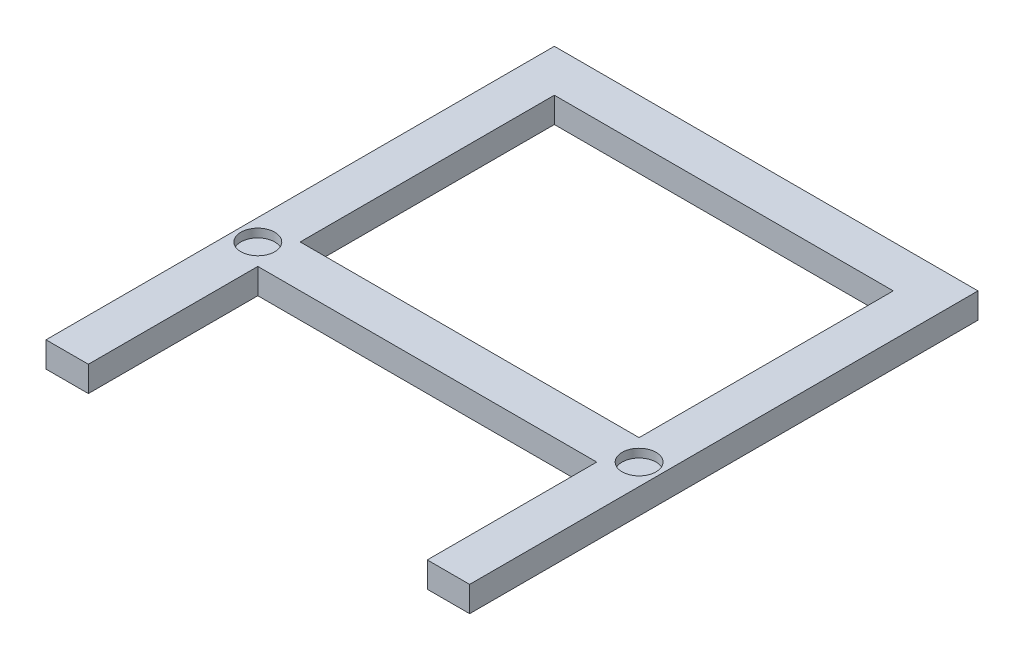
ISO-10303-21;
HEADER;
FILE_DESCRIPTION(('STEP AP214'),'2;1');
FILE_NAME('part.step','',(''),(''),'','','');
FILE_SCHEMA(('AUTOMOTIVE_DESIGN { 1 0 10303 214 1 1 1 1 }'));
ENDSEC;
DATA;
#1=APPLICATION_CONTEXT('core data for automotive mechanical design processes');
#2=APPLICATION_PROTOCOL_DEFINITION('international standard','automotive_design',2000,#1);
#3=PRODUCT_CONTEXT('',#1,'mechanical');
#4=PRODUCT('Part','Part','',(#3));
#5=PRODUCT_RELATED_PRODUCT_CATEGORY('part','',(#4));
#6=PRODUCT_DEFINITION_FORMATION('','',#4);
#7=PRODUCT_DEFINITION_CONTEXT('part definition',#1,'design');
#8=PRODUCT_DEFINITION('design','',#6,#7);
#9=PRODUCT_DEFINITION_SHAPE('','',#8);
#10=(LENGTH_UNIT() NAMED_UNIT(*) SI_UNIT(.MILLI.,.METRE.));
#11=(NAMED_UNIT(*) PLANE_ANGLE_UNIT() SI_UNIT($,.RADIAN.));
#12=(NAMED_UNIT(*) SI_UNIT($,.STERADIAN.) SOLID_ANGLE_UNIT());
#13=UNCERTAINTY_MEASURE_WITH_UNIT(LENGTH_MEASURE(1.E-05),#10,'distance_accuracy_value','');
#14=(GEOMETRIC_REPRESENTATION_CONTEXT(3) GLOBAL_UNCERTAINTY_ASSIGNED_CONTEXT((#13)) GLOBAL_UNIT_ASSIGNED_CONTEXT((#10,
#11,#12)) REPRESENTATION_CONTEXT('',''));
#15=CARTESIAN_POINT('',(0.,0.,0.));
#16=DIRECTION('',(0.,0.,1.));
#17=DIRECTION('',(1.,0.,0.));
#18=AXIS2_PLACEMENT_3D('',#15,#16,#17);
#19=CARTESIAN_POINT('',(0.,3.,0.));
#20=DIRECTION('',(0.,-1.,0.));
#21=DIRECTION('',(0.,0.,-1.));
#22=AXIS2_PLACEMENT_3D('',#19,#20,#21);
#23=PLANE('',#22);
#24=CARTESIAN_POINT('',(-45.,3.,75.));
#25=DIRECTION('',(0.,1.,0.));
#26=DIRECTION('',(0.,0.,1.));
#27=AXIS2_PLACEMENT_3D('',#24,#25,#26);
#28=CIRCLE('',#27,4.00000000000001);
#29=CARTESIAN_POINT('',(-45.,3.,79.));
#30=VERTEX_POINT('',#29);
#31=EDGE_CURVE('E355',#30,#30,#28,.T.);
#32=ORIENTED_EDGE('',*,*,#31,.F.);
#33=EDGE_LOOP('',(#32));
#34=FACE_BOUND('',#33,.T.);
#35=CARTESIAN_POINT('',(45.,3.,75.));
#36=DIRECTION('',(0.,1.,0.));
#37=DIRECTION('',(0.,0.,1.));
#38=AXIS2_PLACEMENT_3D('',#35,#36,#37);
#39=CIRCLE('',#38,4.00000000000001);
#40=CARTESIAN_POINT('',(45.,3.,79.));
#41=VERTEX_POINT('',#40);
#42=EDGE_CURVE('E359',#41,#41,#39,.T.);
#43=ORIENTED_EDGE('',*,*,#42,.F.);
#44=EDGE_LOOP('',(#43));
#45=FACE_BOUND('',#44,.T.);
#46=DIRECTION('',(1.,0.,0.));
#47=VECTOR('',#46,1.);
#48=CARTESIAN_POINT('',(50.,3.,120.));
#49=LINE('',#48,#47);
#50=CARTESIAN_POINT('',(40.,3.,120.));
#51=VERTEX_POINT('',#50);
#52=CARTESIAN_POINT('',(50.,3.,120.));
#53=VERTEX_POINT('',#52);
#54=EDGE_CURVE('E183',#51,#53,#49,.T.);
#55=ORIENTED_EDGE('',*,*,#54,.T.);
#56=DIRECTION('',(0.,0.,-1.));
#57=VECTOR('',#56,1.);
#58=CARTESIAN_POINT('',(50.,3.,0.));
#59=LINE('',#58,#57);
#60=CARTESIAN_POINT('',(50.,3.,0.));
#61=VERTEX_POINT('',#60);
#62=EDGE_CURVE('E187',#53,#61,#59,.T.);
#63=ORIENTED_EDGE('',*,*,#62,.T.);
#64=DIRECTION('',(-1.,0.,0.));
#65=VECTOR('',#64,1.);
#66=CARTESIAN_POINT('',(-50.,3.,0.));
#67=LINE('',#66,#65);
#68=CARTESIAN_POINT('',(-50.,3.,0.));
#69=VERTEX_POINT('',#68);
#70=EDGE_CURVE('E191',#61,#69,#67,.T.);
#71=ORIENTED_EDGE('',*,*,#70,.T.);
#72=DIRECTION('',(0.,0.,1.));
#73=VECTOR('',#72,1.);
#74=CARTESIAN_POINT('',(-50.,3.,120.));
#75=LINE('',#74,#73);
#76=CARTESIAN_POINT('',(-50.,3.,120.));
#77=VERTEX_POINT('',#76);
#78=EDGE_CURVE('E194',#69,#77,#75,.T.);
#79=ORIENTED_EDGE('',*,*,#78,.T.);
#80=DIRECTION('',(1.,0.,0.));
#81=VECTOR('',#80,1.);
#82=CARTESIAN_POINT('',(-50.,3.,120.));
#83=LINE('',#82,#81);
#84=CARTESIAN_POINT('',(-40.,3.,120.));
#85=VERTEX_POINT('',#84);
#86=EDGE_CURVE('E197',#77,#85,#83,.T.);
#87=ORIENTED_EDGE('',*,*,#86,.T.);
#88=DIRECTION('',(0.,0.,-1.));
#89=VECTOR('',#88,1.);
#90=CARTESIAN_POINT('',(-40.,3.,80.));
#91=LINE('',#90,#89);
#92=CARTESIAN_POINT('',(-40.,3.,80.));
#93=VERTEX_POINT('',#92);
#94=EDGE_CURVE('E200',#85,#93,#91,.T.);
#95=ORIENTED_EDGE('',*,*,#94,.T.);
#96=DIRECTION('',(1.,0.,0.));
#97=VECTOR('',#96,1.);
#98=CARTESIAN_POINT('',(40.,3.,80.));
#99=LINE('',#98,#97);
#100=CARTESIAN_POINT('',(40.,3.,80.));
#101=VERTEX_POINT('',#100);
#102=EDGE_CURVE('E203',#93,#101,#99,.T.);
#103=ORIENTED_EDGE('',*,*,#102,.T.);
#104=DIRECTION('',(0.,0.,1.));
#105=VECTOR('',#104,1.);
#106=CARTESIAN_POINT('',(40.,3.,120.));
#107=LINE('',#106,#105);
#108=EDGE_CURVE('E206',#101,#51,#107,.T.);
#109=ORIENTED_EDGE('',*,*,#108,.T.);
#110=EDGE_LOOP('',(#55,#63,#71,#79,#87,#95,#103,#109));
#111=FACE_BOUND('',#110,.T.);
#112=DIRECTION('',(0.,0.,-1.));
#113=VECTOR('',#112,1.);
#114=CARTESIAN_POINT('',(40.,3.,70.));
#115=LINE('',#114,#113);
#116=CARTESIAN_POINT('',(40.,3.,70.));
#117=VERTEX_POINT('',#116);
#118=CARTESIAN_POINT('',(40.,3.,10.));
#119=VERTEX_POINT('',#118);
#120=EDGE_CURVE('E133',#117,#119,#115,.T.);
#121=ORIENTED_EDGE('',*,*,#120,.F.);
#122=DIRECTION('',(1.,0.,0.));
#123=VECTOR('',#122,1.);
#124=CARTESIAN_POINT('',(-40.,3.,70.));
#125=LINE('',#124,#123);
#126=CARTESIAN_POINT('',(-40.,3.,70.));
#127=VERTEX_POINT('',#126);
#128=EDGE_CURVE('E159',#127,#117,#125,.T.);
#129=ORIENTED_EDGE('',*,*,#128,.F.);
#130=DIRECTION('',(0.,0.,1.));
#131=VECTOR('',#130,1.);
#132=CARTESIAN_POINT('',(-40.,3.,10.));
#133=LINE('',#132,#131);
#134=CARTESIAN_POINT('',(-40.,3.,10.));
#135=VERTEX_POINT('',#134);
#136=EDGE_CURVE('E155',#135,#127,#133,.T.);
#137=ORIENTED_EDGE('',*,*,#136,.F.);
#138=DIRECTION('',(-1.,0.,0.));
#139=VECTOR('',#138,1.);
#140=CARTESIAN_POINT('',(40.,3.,10.));
#141=LINE('',#140,#139);
#142=EDGE_CURVE('E142',#119,#135,#141,.T.);
#143=ORIENTED_EDGE('',*,*,#142,.F.);
#144=EDGE_LOOP('',(#121,#129,#137,#143));
#145=FACE_BOUND('',#144,.T.);
#146=ADVANCED_FACE('F43',(#34,#45,#111,#145),#23,.F.);
#147=CARTESIAN_POINT('',(0.,-3.,0.));
#148=DIRECTION('',(0.,-1.,0.));
#149=DIRECTION('',(0.,0.,-1.));
#150=AXIS2_PLACEMENT_3D('',#147,#148,#149);
#151=PLANE('',#150);
#152=DIRECTION('',(1.,0.,0.));
#153=VECTOR('',#152,1.);
#154=CARTESIAN_POINT('',(50.,-3.,120.));
#155=LINE('',#154,#153);
#156=CARTESIAN_POINT('',(40.,-3.,120.));
#157=VERTEX_POINT('',#156);
#158=CARTESIAN_POINT('',(50.,-3.,120.));
#159=VERTEX_POINT('',#158);
#160=EDGE_CURVE('E151',#157,#159,#155,.T.);
#161=ORIENTED_EDGE('',*,*,#160,.F.);
#162=DIRECTION('',(0.,0.,1.));
#163=VECTOR('',#162,1.);
#164=CARTESIAN_POINT('',(40.,-3.,120.));
#165=LINE('',#164,#163);
#166=CARTESIAN_POINT('',(40.,-3.,80.));
#167=VERTEX_POINT('',#166);
#168=EDGE_CURVE('E188',#167,#157,#165,.T.);
#169=ORIENTED_EDGE('',*,*,#168,.F.);
#170=DIRECTION('',(1.,0.,0.));
#171=VECTOR('',#170,1.);
#172=CARTESIAN_POINT('',(40.,-3.,80.));
#173=LINE('',#172,#171);
#174=CARTESIAN_POINT('',(-40.,-3.,80.));
#175=VERTEX_POINT('',#174);
#176=EDGE_CURVE('E228',#175,#167,#173,.T.);
#177=ORIENTED_EDGE('',*,*,#176,.F.);
#178=DIRECTION('',(0.,0.,-1.));
#179=VECTOR('',#178,1.);
#180=CARTESIAN_POINT('',(-40.,-3.,80.));
#181=LINE('',#180,#179);
#182=CARTESIAN_POINT('',(-40.,-3.,120.));
#183=VERTEX_POINT('',#182);
#184=EDGE_CURVE('E225',#183,#175,#181,.T.);
#185=ORIENTED_EDGE('',*,*,#184,.F.);
#186=DIRECTION('',(1.,0.,0.));
#187=VECTOR('',#186,1.);
#188=CARTESIAN_POINT('',(-50.,-3.,120.));
#189=LINE('',#188,#187);
#190=CARTESIAN_POINT('',(-50.,-3.,120.));
#191=VERTEX_POINT('',#190);
#192=EDGE_CURVE('E222',#191,#183,#189,.T.);
#193=ORIENTED_EDGE('',*,*,#192,.F.);
#194=DIRECTION('',(0.,0.,1.));
#195=VECTOR('',#194,1.);
#196=CARTESIAN_POINT('',(-50.,-3.,120.));
#197=LINE('',#196,#195);
#198=CARTESIAN_POINT('',(-50.,-3.,0.));
#199=VERTEX_POINT('',#198);
#200=EDGE_CURVE('E219',#199,#191,#197,.T.);
#201=ORIENTED_EDGE('',*,*,#200,.F.);
#202=DIRECTION('',(-1.,0.,0.));
#203=VECTOR('',#202,1.);
#204=CARTESIAN_POINT('',(-50.,-3.,0.));
#205=LINE('',#204,#203);
#206=CARTESIAN_POINT('',(50.,-3.,0.));
#207=VERTEX_POINT('',#206);
#208=EDGE_CURVE('E216',#207,#199,#205,.T.);
#209=ORIENTED_EDGE('',*,*,#208,.F.);
#210=DIRECTION('',(0.,0.,-1.));
#211=VECTOR('',#210,1.);
#212=CARTESIAN_POINT('',(50.,-3.,0.));
#213=LINE('',#212,#211);
#214=EDGE_CURVE('E213',#159,#207,#213,.T.);
#215=ORIENTED_EDGE('',*,*,#214,.F.);
#216=EDGE_LOOP('',(#161,#169,#177,#185,#193,#201,#209,#215));
#217=FACE_BOUND('',#216,.T.);
#218=DIRECTION('',(1.,0.,0.));
#219=VECTOR('',#218,1.);
#220=CARTESIAN_POINT('',(-40.,-3.,70.));
#221=LINE('',#220,#219);
#222=CARTESIAN_POINT('',(-40.,-3.,70.));
#223=VERTEX_POINT('',#222);
#224=CARTESIAN_POINT('',(40.,-3.,70.));
#225=VERTEX_POINT('',#224);
#226=EDGE_CURVE('E143',#223,#225,#221,.T.);
#227=ORIENTED_EDGE('',*,*,#226,.T.);
#228=DIRECTION('',(0.,0.,-1.));
#229=VECTOR('',#228,1.);
#230=CARTESIAN_POINT('',(40.,-3.,70.));
#231=LINE('',#230,#229);
#232=CARTESIAN_POINT('',(40.,-3.,10.));
#233=VERTEX_POINT('',#232);
#234=EDGE_CURVE('E67',#225,#233,#231,.T.);
#235=ORIENTED_EDGE('',*,*,#234,.T.);
#236=DIRECTION('',(-1.,0.,0.));
#237=VECTOR('',#236,1.);
#238=CARTESIAN_POINT('',(40.,-3.,10.));
#239=LINE('',#238,#237);
#240=CARTESIAN_POINT('',(-40.,-3.,10.));
#241=VERTEX_POINT('',#240);
#242=EDGE_CURVE('E149',#233,#241,#239,.T.);
#243=ORIENTED_EDGE('',*,*,#242,.T.);
#244=DIRECTION('',(0.,0.,1.));
#245=VECTOR('',#244,1.);
#246=CARTESIAN_POINT('',(-40.,-3.,10.));
#247=LINE('',#246,#245);
#248=EDGE_CURVE('E170',#241,#223,#247,.T.);
#249=ORIENTED_EDGE('',*,*,#248,.T.);
#250=EDGE_LOOP('',(#227,#235,#243,#249));
#251=FACE_BOUND('',#250,.T.);
#252=ADVANCED_FACE('F267',(#217,#251),#151,.T.);
#253=CARTESIAN_POINT('',(50.,3.,120.));
#254=DIRECTION('',(0.,0.,-1.));
#255=DIRECTION('',(-1.,0.,0.));
#256=AXIS2_PLACEMENT_3D('',#253,#254,#255);
#257=PLANE('',#256);
#258=ORIENTED_EDGE('',*,*,#160,.T.);
#259=DIRECTION('',(0.,-1.,0.));
#260=VECTOR('',#259,1.);
#261=CARTESIAN_POINT('',(50.,3.,120.));
#262=LINE('',#261,#260);
#263=EDGE_CURVE('E11',#53,#159,#262,.T.);
#264=ORIENTED_EDGE('',*,*,#263,.F.);
#265=ORIENTED_EDGE('',*,*,#54,.F.);
#266=DIRECTION('',(0.,-1.,0.));
#267=VECTOR('',#266,1.);
#268=CARTESIAN_POINT('',(40.,3.,120.));
#269=LINE('',#268,#267);
#270=EDGE_CURVE('E209',#51,#157,#269,.T.);
#271=ORIENTED_EDGE('',*,*,#270,.T.);
#272=EDGE_LOOP('',(#258,#264,#265,#271));
#273=FACE_BOUND('',#272,.T.);
#274=ADVANCED_FACE('F45',(#273),#257,.F.);
#275=CARTESIAN_POINT('',(50.,3.,0.));
#276=DIRECTION('',(-1.,0.,0.));
#277=DIRECTION('',(0.,0.,1.));
#278=AXIS2_PLACEMENT_3D('',#275,#276,#277);
#279=PLANE('',#278);
#280=ORIENTED_EDGE('',*,*,#214,.T.);
#281=DIRECTION('',(0.,-1.,0.));
#282=VECTOR('',#281,1.);
#283=CARTESIAN_POINT('',(50.,3.,0.));
#284=LINE('',#283,#282);
#285=EDGE_CURVE('E52',#61,#207,#284,.T.);
#286=ORIENTED_EDGE('',*,*,#285,.F.);
#287=ORIENTED_EDGE('',*,*,#62,.F.);
#288=ORIENTED_EDGE('',*,*,#263,.T.);
#289=EDGE_LOOP('',(#280,#286,#287,#288));
#290=FACE_BOUND('',#289,.T.);
#291=ADVANCED_FACE('F284',(#290),#279,.F.);
#292=CARTESIAN_POINT('',(-50.,3.,0.));
#293=DIRECTION('',(0.,0.,1.));
#294=DIRECTION('',(1.,0.,0.));
#295=AXIS2_PLACEMENT_3D('',#292,#293,#294);
#296=PLANE('',#295);
#297=ORIENTED_EDGE('',*,*,#208,.T.);
#298=DIRECTION('',(0.,-1.,0.));
#299=VECTOR('',#298,1.);
#300=CARTESIAN_POINT('',(-50.,3.,0.));
#301=LINE('',#300,#299);
#302=EDGE_CURVE('E252',#69,#199,#301,.T.);
#303=ORIENTED_EDGE('',*,*,#302,.F.);
#304=ORIENTED_EDGE('',*,*,#70,.F.);
#305=ORIENTED_EDGE('',*,*,#285,.T.);
#306=EDGE_LOOP('',(#297,#303,#304,#305));
#307=FACE_BOUND('',#306,.T.);
#308=ADVANCED_FACE('F261',(#307),#296,.F.);
#309=CARTESIAN_POINT('',(-50.,3.,120.));
#310=DIRECTION('',(1.,0.,0.));
#311=DIRECTION('',(0.,0.,-1.));
#312=AXIS2_PLACEMENT_3D('',#309,#310,#311);
#313=PLANE('',#312);
#314=ORIENTED_EDGE('',*,*,#200,.T.);
#315=DIRECTION('',(0.,-1.,0.));
#316=VECTOR('',#315,1.);
#317=CARTESIAN_POINT('',(-50.,3.,120.));
#318=LINE('',#317,#316);
#319=EDGE_CURVE('E248',#77,#191,#318,.T.);
#320=ORIENTED_EDGE('',*,*,#319,.F.);
#321=ORIENTED_EDGE('',*,*,#78,.F.);
#322=ORIENTED_EDGE('',*,*,#302,.T.);
#323=EDGE_LOOP('',(#314,#320,#321,#322));
#324=FACE_BOUND('',#323,.T.);
#325=ADVANCED_FACE('F273',(#324),#313,.F.);
#326=CARTESIAN_POINT('',(-50.,3.,120.));
#327=DIRECTION('',(0.,0.,-1.));
#328=DIRECTION('',(-1.,0.,0.));
#329=AXIS2_PLACEMENT_3D('',#326,#327,#328);
#330=PLANE('',#329);
#331=ORIENTED_EDGE('',*,*,#192,.T.);
#332=DIRECTION('',(0.,-1.,0.));
#333=VECTOR('',#332,1.);
#334=CARTESIAN_POINT('',(-40.,3.,120.));
#335=LINE('',#334,#333);
#336=EDGE_CURVE('E244',#85,#183,#335,.T.);
#337=ORIENTED_EDGE('',*,*,#336,.F.);
#338=ORIENTED_EDGE('',*,*,#86,.F.);
#339=ORIENTED_EDGE('',*,*,#319,.T.);
#340=EDGE_LOOP('',(#331,#337,#338,#339));
#341=FACE_BOUND('',#340,.T.);
#342=ADVANCED_FACE('F277',(#341),#330,.F.);
#343=CARTESIAN_POINT('',(-40.,3.,80.));
#344=DIRECTION('',(-1.,0.,0.));
#345=DIRECTION('',(0.,0.,1.));
#346=AXIS2_PLACEMENT_3D('',#343,#344,#345);
#347=PLANE('',#346);
#348=ORIENTED_EDGE('',*,*,#184,.T.);
#349=DIRECTION('',(0.,-1.,0.));
#350=VECTOR('',#349,1.);
#351=CARTESIAN_POINT('',(-40.,3.,80.));
#352=LINE('',#351,#350);
#353=EDGE_CURVE('E240',#93,#175,#352,.T.);
#354=ORIENTED_EDGE('',*,*,#353,.F.);
#355=ORIENTED_EDGE('',*,*,#94,.F.);
#356=ORIENTED_EDGE('',*,*,#336,.T.);
#357=EDGE_LOOP('',(#348,#354,#355,#356));
#358=FACE_BOUND('',#357,.T.);
#359=ADVANCED_FACE('F297',(#358),#347,.F.);
#360=CARTESIAN_POINT('',(40.,3.,80.));
#361=DIRECTION('',(0.,0.,-1.));
#362=DIRECTION('',(-1.,0.,0.));
#363=AXIS2_PLACEMENT_3D('',#360,#361,#362);
#364=PLANE('',#363);
#365=ORIENTED_EDGE('',*,*,#176,.T.);
#366=DIRECTION('',(0.,-1.,0.));
#367=VECTOR('',#366,1.);
#368=CARTESIAN_POINT('',(40.,3.,80.));
#369=LINE('',#368,#367);
#370=EDGE_CURVE('E236',#101,#167,#369,.T.);
#371=ORIENTED_EDGE('',*,*,#370,.F.);
#372=ORIENTED_EDGE('',*,*,#102,.F.);
#373=ORIENTED_EDGE('',*,*,#353,.T.);
#374=EDGE_LOOP('',(#365,#371,#372,#373));
#375=FACE_BOUND('',#374,.T.);
#376=ADVANCED_FACE('F295',(#375),#364,.F.);
#377=CARTESIAN_POINT('',(40.,3.,120.));
#378=DIRECTION('',(1.,0.,0.));
#379=DIRECTION('',(0.,0.,-1.));
#380=AXIS2_PLACEMENT_3D('',#377,#378,#379);
#381=PLANE('',#380);
#382=ORIENTED_EDGE('',*,*,#168,.T.);
#383=ORIENTED_EDGE('',*,*,#270,.F.);
#384=ORIENTED_EDGE('',*,*,#108,.F.);
#385=ORIENTED_EDGE('',*,*,#370,.T.);
#386=EDGE_LOOP('',(#382,#383,#384,#385));
#387=FACE_BOUND('',#386,.T.);
#388=ADVANCED_FACE('F290',(#387),#381,.F.);
#389=CARTESIAN_POINT('',(40.,3.,70.));
#390=DIRECTION('',(-1.,0.,0.));
#391=DIRECTION('',(0.,0.,1.));
#392=AXIS2_PLACEMENT_3D('',#389,#390,#391);
#393=PLANE('',#392);
#394=ORIENTED_EDGE('',*,*,#234,.F.);
#395=DIRECTION('',(0.,-1.,0.));
#396=VECTOR('',#395,1.);
#397=CARTESIAN_POINT('',(40.,3.,70.));
#398=LINE('',#397,#396);
#399=EDGE_CURVE('E137',#117,#225,#398,.T.);
#400=ORIENTED_EDGE('',*,*,#399,.F.);
#401=ORIENTED_EDGE('',*,*,#120,.T.);
#402=DIRECTION('',(0.,-1.,0.));
#403=VECTOR('',#402,1.);
#404=CARTESIAN_POINT('',(40.,3.,10.));
#405=LINE('',#404,#403);
#406=EDGE_CURVE('E136',#119,#233,#405,.T.);
#407=ORIENTED_EDGE('',*,*,#406,.T.);
#408=EDGE_LOOP('',(#394,#400,#401,#407));
#409=FACE_BOUND('',#408,.T.);
#410=ADVANCED_FACE('F135',(#409),#393,.T.);
#411=CARTESIAN_POINT('',(40.,3.,10.));
#412=DIRECTION('',(0.,0.,1.));
#413=DIRECTION('',(1.,0.,0.));
#414=AXIS2_PLACEMENT_3D('',#411,#412,#413);
#415=PLANE('',#414);
#416=ORIENTED_EDGE('',*,*,#242,.F.);
#417=ORIENTED_EDGE('',*,*,#406,.F.);
#418=ORIENTED_EDGE('',*,*,#142,.T.);
#419=DIRECTION('',(0.,-1.,0.));
#420=VECTOR('',#419,1.);
#421=CARTESIAN_POINT('',(-40.,3.,10.));
#422=LINE('',#421,#420);
#423=EDGE_CURVE('E152',#135,#241,#422,.T.);
#424=ORIENTED_EDGE('',*,*,#423,.T.);
#425=EDGE_LOOP('',(#416,#417,#418,#424));
#426=FACE_BOUND('',#425,.T.);
#427=ADVANCED_FACE('F146',(#426),#415,.T.);
#428=CARTESIAN_POINT('',(-40.,3.,10.));
#429=DIRECTION('',(1.,0.,0.));
#430=DIRECTION('',(0.,0.,-1.));
#431=AXIS2_PLACEMENT_3D('',#428,#429,#430);
#432=PLANE('',#431);
#433=ORIENTED_EDGE('',*,*,#248,.F.);
#434=ORIENTED_EDGE('',*,*,#423,.F.);
#435=ORIENTED_EDGE('',*,*,#136,.T.);
#436=DIRECTION('',(0.,-1.,0.));
#437=VECTOR('',#436,1.);
#438=CARTESIAN_POINT('',(-40.,3.,70.));
#439=LINE('',#438,#437);
#440=EDGE_CURVE('E59',#127,#223,#439,.T.);
#441=ORIENTED_EDGE('',*,*,#440,.T.);
#442=EDGE_LOOP('',(#433,#434,#435,#441));
#443=FACE_BOUND('',#442,.T.);
#444=ADVANCED_FACE('F325',(#443),#432,.T.);
#445=CARTESIAN_POINT('',(-40.,3.,70.));
#446=DIRECTION('',(0.,0.,-1.));
#447=DIRECTION('',(-1.,0.,0.));
#448=AXIS2_PLACEMENT_3D('',#445,#446,#447);
#449=PLANE('',#448);
#450=ORIENTED_EDGE('',*,*,#226,.F.);
#451=ORIENTED_EDGE('',*,*,#440,.F.);
#452=ORIENTED_EDGE('',*,*,#128,.T.);
#453=ORIENTED_EDGE('',*,*,#399,.T.);
#454=EDGE_LOOP('',(#450,#451,#452,#453));
#455=FACE_BOUND('',#454,.T.);
#456=ADVANCED_FACE('F329',(#455),#449,.T.);
#457=CARTESIAN_POINT('',(45.,1.,75.));
#458=DIRECTION('',(0.,1.,0.));
#459=DIRECTION('',(0.,0.,1.));
#460=AXIS2_PLACEMENT_3D('',#457,#458,#459);
#461=CYLINDRICAL_SURFACE('',#460,4.00000000000001);
#462=CARTESIAN_POINT('',(45.,1.,75.));
#463=DIRECTION('',(0.,1.,0.));
#464=DIRECTION('',(0.,0.,1.));
#465=AXIS2_PLACEMENT_3D('',#462,#463,#464);
#466=CIRCLE('',#465,4.00000000000001);
#467=CARTESIAN_POINT('',(45.,1.,79.));
#468=VERTEX_POINT('',#467);
#469=EDGE_CURVE('E364',#468,#468,#466,.T.);
#470=ORIENTED_EDGE('',*,*,#469,.F.);
#471=EDGE_LOOP('',(#470));
#472=FACE_BOUND('',#471,.T.);
#473=ORIENTED_EDGE('',*,*,#42,.T.);
#474=EDGE_LOOP('',(#473));
#475=FACE_BOUND('',#474,.T.);
#476=ADVANCED_FACE('F335',(#472,#475),#461,.F.);
#477=CARTESIAN_POINT('',(45.,1.,75.));
#478=DIRECTION('',(0.,1.,0.));
#479=DIRECTION('',(0.,0.,1.));
#480=AXIS2_PLACEMENT_3D('',#477,#478,#479);
#481=PLANE('',#480);
#482=ORIENTED_EDGE('',*,*,#469,.T.);
#483=EDGE_LOOP('',(#482));
#484=FACE_BOUND('',#483,.T.);
#485=ADVANCED_FACE('F336',(#484),#481,.T.);
#486=CARTESIAN_POINT('',(-45.,1.,75.));
#487=DIRECTION('',(0.,1.,0.));
#488=DIRECTION('',(0.,0.,1.));
#489=AXIS2_PLACEMENT_3D('',#486,#487,#488);
#490=CYLINDRICAL_SURFACE('',#489,4.00000000000001);
#491=CARTESIAN_POINT('',(-45.,1.,75.));
#492=DIRECTION('',(0.,1.,0.));
#493=DIRECTION('',(0.,0.,1.));
#494=AXIS2_PLACEMENT_3D('',#491,#492,#493);
#495=CIRCLE('',#494,4.00000000000001);
#496=CARTESIAN_POINT('',(-45.,1.,79.));
#497=VERTEX_POINT('',#496);
#498=EDGE_CURVE('E167',#497,#497,#495,.T.);
#499=ORIENTED_EDGE('',*,*,#498,.F.);
#500=EDGE_LOOP('',(#499));
#501=FACE_BOUND('',#500,.T.);
#502=ORIENTED_EDGE('',*,*,#31,.T.);
#503=EDGE_LOOP('',(#502));
#504=FACE_BOUND('',#503,.T.);
#505=ADVANCED_FACE('F339',(#501,#504),#490,.F.);
#506=CARTESIAN_POINT('',(-45.,1.,75.));
#507=DIRECTION('',(0.,1.,0.));
#508=DIRECTION('',(0.,0.,1.));
#509=AXIS2_PLACEMENT_3D('',#506,#507,#508);
#510=PLANE('',#509);
#511=ORIENTED_EDGE('',*,*,#498,.T.);
#512=EDGE_LOOP('',(#511));
#513=FACE_BOUND('',#512,.T.);
#514=ADVANCED_FACE('F346',(#513),#510,.T.);
#515=CLOSED_SHELL('',(#146,#252,#274,#291,#308,#325,#342,#359,#376,#388,#410,#427,#444,#456,
#476,#485,#505,#514));
#516=MANIFOLD_SOLID_BREP('B2',#515);
#517=ADVANCED_BREP_SHAPE_REPRESENTATION('',(#18,#516),#14);
#518=SHAPE_DEFINITION_REPRESENTATION(#9,#517);
ENDSEC;
END-ISO-10303-21;
